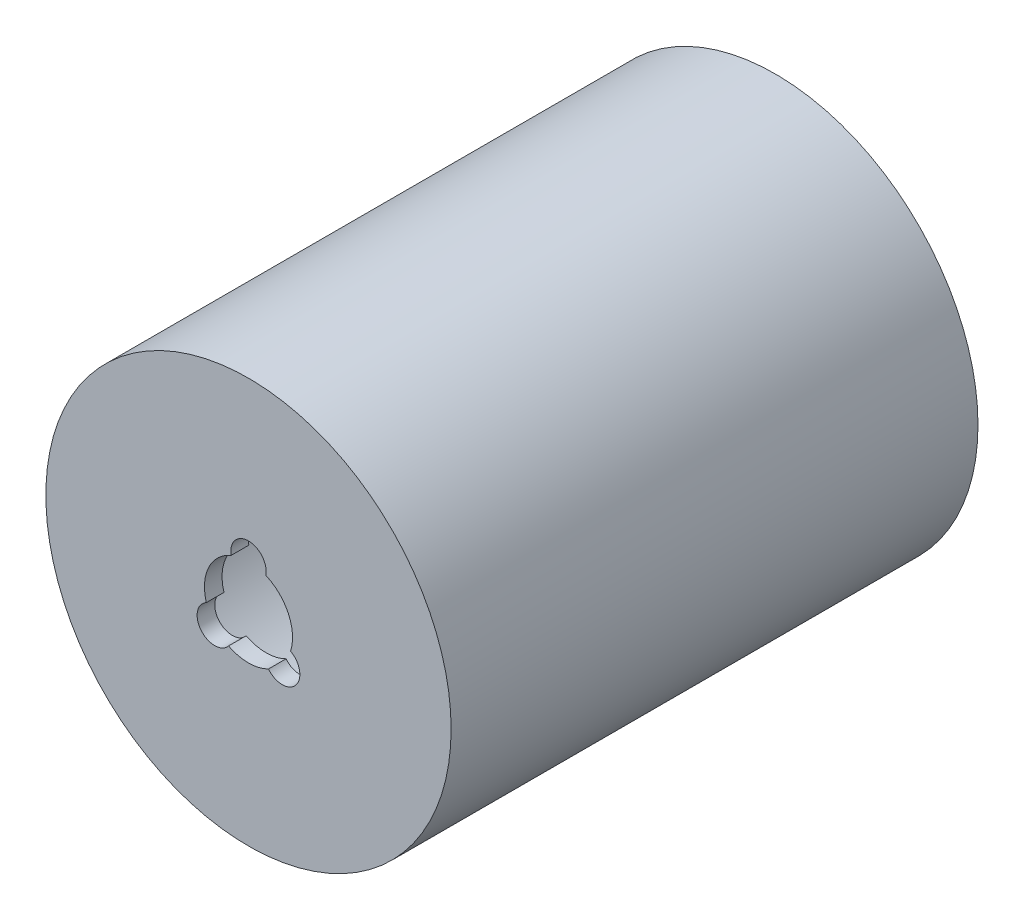
ISO-10303-21;
HEADER;
FILE_DESCRIPTION(('STEP AP214'),'2;1');
FILE_NAME('part.step','',(''),(''),'','','');
FILE_SCHEMA(('AUTOMOTIVE_DESIGN { 1 0 10303 214 1 1 1 1 }'));
ENDSEC;
DATA;
#1=APPLICATION_CONTEXT('core data for automotive mechanical design processes');
#2=APPLICATION_PROTOCOL_DEFINITION('international standard','automotive_design',2000,#1);
#3=PRODUCT_CONTEXT('',#1,'mechanical');
#4=PRODUCT('Part','Part','',(#3));
#5=PRODUCT_RELATED_PRODUCT_CATEGORY('part','',(#4));
#6=PRODUCT_DEFINITION_FORMATION('','',#4);
#7=PRODUCT_DEFINITION_CONTEXT('part definition',#1,'design');
#8=PRODUCT_DEFINITION('design','',#6,#7);
#9=PRODUCT_DEFINITION_SHAPE('','',#8);
#10=(LENGTH_UNIT() NAMED_UNIT(*) SI_UNIT(.MILLI.,.METRE.));
#11=(NAMED_UNIT(*) PLANE_ANGLE_UNIT() SI_UNIT($,.RADIAN.));
#12=(NAMED_UNIT(*) SI_UNIT($,.STERADIAN.) SOLID_ANGLE_UNIT());
#13=UNCERTAINTY_MEASURE_WITH_UNIT(LENGTH_MEASURE(1.E-05),#10,'distance_accuracy_value','');
#14=(GEOMETRIC_REPRESENTATION_CONTEXT(3) GLOBAL_UNCERTAINTY_ASSIGNED_CONTEXT((#13)) GLOBAL_UNIT_ASSIGNED_CONTEXT((#10,
#11,#12)) REPRESENTATION_CONTEXT('',''));
#15=CARTESIAN_POINT('',(0.,0.,0.));
#16=DIRECTION('',(0.,0.,1.));
#17=DIRECTION('',(1.,0.,0.));
#18=AXIS2_PLACEMENT_3D('',#15,#16,#17);
#19=CARTESIAN_POINT('',(0.,0.,1072.38147752167));
#20=DIRECTION('',(0.,0.,1.));
#21=DIRECTION('',(1.,0.,0.));
#22=AXIS2_PLACEMENT_3D('',#19,#20,#21);
#23=CYLINDRICAL_SURFACE('',#22,5.);
#24=CARTESIAN_POINT('',(0.,0.,57.8000000000001));
#25=DIRECTION('',(0.,0.,1.));
#26=DIRECTION('',(1.,0.,0.));
#27=AXIS2_PLACEMENT_3D('',#24,#25,#26);
#28=CIRCLE('',#27,5.);
#29=CARTESIAN_POINT('',(-2.26420311297507,-4.45795740930687,57.8));
#30=VERTEX_POINT('',#29);
#31=CARTESIAN_POINT('',(2.26420311297507,-4.45795740930687,57.8));
#32=VERTEX_POINT('',#31);
#33=EDGE_CURVE('E283',#30,#32,#28,.T.);
#34=ORIENTED_EDGE('',*,*,#33,.F.);
#35=DIRECTION('',(0.,0.,1.));
#36=VECTOR('',#35,1.);
#37=CARTESIAN_POINT('',(-2.26420311297507,-4.45795740930687,-0.001000000000001));
#38=LINE('',#37,#36);
#39=CARTESIAN_POINT('',(-2.26420311297507,-4.45795740930687,59.8));
#40=VERTEX_POINT('',#39);
#41=EDGE_CURVE('E107',#30,#40,#38,.T.);
#42=ORIENTED_EDGE('',*,*,#41,.T.);
#43=CARTESIAN_POINT('',(0.,0.,59.8000000000001));
#44=DIRECTION('',(0.,0.,1.));
#45=DIRECTION('',(1.,0.,0.));
#46=AXIS2_PLACEMENT_3D('',#43,#44,#45);
#47=CIRCLE('',#46,5.);
#48=CARTESIAN_POINT('',(2.26420311297507,-4.45795740930687,59.8));
#49=VERTEX_POINT('',#48);
#50=EDGE_CURVE('E289',#40,#49,#47,.T.);
#51=ORIENTED_EDGE('',*,*,#50,.T.);
#52=DIRECTION('',(0.,0.,1.));
#53=VECTOR('',#52,1.);
#54=CARTESIAN_POINT('',(2.26420311297507,-4.45795740930687,-0.001000000000001));
#55=LINE('',#54,#53);
#56=EDGE_CURVE('E578',#32,#49,#55,.T.);
#57=ORIENTED_EDGE('',*,*,#56,.F.);
#58=EDGE_LOOP('',(#34,#42,#51,#57));
#59=FACE_BOUND('',#58,.T.);
#60=ADVANCED_FACE('F83',(#59),#23,.F.);
#61=CARTESIAN_POINT('',(-1.95959179422654,4.6,59.8));
#62=VERTEX_POINT('',#61);
#63=CARTESIAN_POINT('',(-4.78340576371954,-1.45568859980928,59.8));
#64=VERTEX_POINT('',#63);
#65=EDGE_CURVE('E273',#62,#64,#47,.T.);
#66=ORIENTED_EDGE('',*,*,#65,.T.);
#67=DIRECTION('',(0.,0.,1.));
#68=VECTOR('',#67,1.);
#69=CARTESIAN_POINT('',(-4.78340576371954,-1.45568859980928,-0.001000000000001));
#70=LINE('',#69,#68);
#71=CARTESIAN_POINT('',(-4.78340576371954,-1.45568859980928,57.8));
#72=VERTEX_POINT('',#71);
#73=EDGE_CURVE('E257',#72,#64,#70,.T.);
#74=ORIENTED_EDGE('',*,*,#73,.F.);
#75=CARTESIAN_POINT('',(-1.95959179422654,4.6,57.8));
#76=VERTEX_POINT('',#75);
#77=EDGE_CURVE('E271',#76,#72,#28,.T.);
#78=ORIENTED_EDGE('',*,*,#77,.F.);
#79=DIRECTION('',(0.,0.,1.));
#80=VECTOR('',#79,1.);
#81=CARTESIAN_POINT('',(-1.95959179422654,4.6,-0.001000000000001));
#82=LINE('',#81,#80);
#83=EDGE_CURVE('E588',#76,#62,#82,.T.);
#84=ORIENTED_EDGE('',*,*,#83,.T.);
#85=EDGE_LOOP('',(#66,#74,#78,#84));
#86=FACE_BOUND('',#85,.T.);
#87=ADVANCED_FACE('F269',(#86),#23,.F.);
#88=CARTESIAN_POINT('',(0.,0.,1072.38147752167));
#89=DIRECTION('',(0.,0.,1.));
#90=DIRECTION('',(1.,0.,0.));
#91=AXIS2_PLACEMENT_3D('',#88,#89,#90);
#92=CYLINDRICAL_SURFACE('',#91,17.);
#93=CARTESIAN_POINT('',(0.,0.,1.80000000000002));
#94=DIRECTION('',(0.,0.,1.));
#95=DIRECTION('',(1.,0.,0.));
#96=AXIS2_PLACEMENT_3D('',#93,#94,#95);
#97=CIRCLE('',#96,17.);
#98=CARTESIAN_POINT('',(17.,0.,1.80000000000002));
#99=VERTEX_POINT('',#98);
#100=EDGE_CURVE('E297',#99,#99,#97,.T.);
#101=ORIENTED_EDGE('',*,*,#100,.F.);
#102=EDGE_LOOP('',(#101));
#103=FACE_BOUND('',#102,.T.);
#104=CARTESIAN_POINT('',(0.,0.,29.8));
#105=DIRECTION('',(0.,0.,1.));
#106=DIRECTION('',(1.,0.,0.));
#107=AXIS2_PLACEMENT_3D('',#104,#105,#106);
#108=CIRCLE('',#107,17.);
#109=CARTESIAN_POINT('',(-4.68397596917369,16.3419817990415,29.8));
#110=VERTEX_POINT('',#109);
#111=CARTESIAN_POINT('',(4.68397596917369,16.3419817990415,29.8));
#112=VERTEX_POINT('',#111);
#113=EDGE_CURVE('E410',#110,#112,#108,.F.);
#114=ORIENTED_EDGE('',*,*,#113,.F.);
#115=DIRECTION('',(0.,0.,1.));
#116=VECTOR('',#115,1.);
#117=CARTESIAN_POINT('',(-4.68397596917369,16.3419817990415,28.8));
#118=LINE('',#117,#116);
#119=CARTESIAN_POINT('',(-4.68397596917369,16.3419817990415,28.8));
#120=VERTEX_POINT('',#119);
#121=EDGE_CURVE('E334',#120,#110,#118,.T.);
#122=ORIENTED_EDGE('',*,*,#121,.F.);
#123=CARTESIAN_POINT('',(0.,0.,28.8));
#124=DIRECTION('',(0.,0.,1.));
#125=DIRECTION('',(1.,0.,0.));
#126=AXIS2_PLACEMENT_3D('',#123,#124,#125);
#127=CIRCLE('',#126,17.);
#128=CARTESIAN_POINT('',(4.68397596917369,16.3419817990415,28.8));
#129=VERTEX_POINT('',#128);
#130=EDGE_CURVE('E432',#120,#129,#127,.T.);
#131=ORIENTED_EDGE('',*,*,#130,.T.);
#132=DIRECTION('',(0.,0.,1.));
#133=VECTOR('',#132,1.);
#134=CARTESIAN_POINT('',(4.68397596917369,16.3419817990415,28.8));
#135=LINE('',#134,#133);
#136=EDGE_CURVE('E329',#129,#112,#135,.T.);
#137=ORIENTED_EDGE('',*,*,#136,.T.);
#138=EDGE_LOOP('',(#114,#122,#131,#137));
#139=FACE_BOUND('',#138,.T.);
#140=ADVANCED_FACE('F630',(#103,#139),#92,.F.);
#141=CARTESIAN_POINT('',(0.,0.,28.8));
#142=DIRECTION('',(0.939692620785902,-0.342020143325687,0.));
#143=DIRECTION('',(0.342020143325687,0.939692620785902,0.));
#144=AXIS2_PLACEMENT_3D('',#141,#142,#143);
#145=PLANE('',#144);
#146=DIRECTION('',(0.342020143325687,0.939692620785902,0.));
#147=VECTOR('',#146,1.);
#148=CARTESIAN_POINT('',(0.,0.,29.8));
#149=LINE('',#148,#147);
#150=CARTESIAN_POINT('',(6.56678675185322,18.0420983190894,29.8));
#151=VERTEX_POINT('',#150);
#152=CARTESIAN_POINT('',(7.59284718183028,20.8611761814471,29.8));
#153=VERTEX_POINT('',#152);
#154=EDGE_CURVE('E564',#151,#153,#149,.T.);
#155=ORIENTED_EDGE('',*,*,#154,.T.);
#156=DIRECTION('',(0.,0.,1.));
#157=VECTOR('',#156,1.);
#158=CARTESIAN_POINT('',(7.59284718183028,20.8611761814471,28.8));
#159=LINE('',#158,#157);
#160=CARTESIAN_POINT('',(7.59284718183028,20.8611761814471,28.8));
#161=VERTEX_POINT('',#160);
#162=EDGE_CURVE('E344',#161,#153,#159,.T.);
#163=ORIENTED_EDGE('',*,*,#162,.F.);
#164=DIRECTION('',(0.342020143325687,0.939692620785902,0.));
#165=VECTOR('',#164,1.);
#166=CARTESIAN_POINT('',(0.,0.,28.8));
#167=LINE('',#166,#165);
#168=CARTESIAN_POINT('',(6.56678675185322,18.0420983190894,28.8));
#169=VERTEX_POINT('',#168);
#170=EDGE_CURVE('E425',#169,#161,#167,.T.);
#171=ORIENTED_EDGE('',*,*,#170,.F.);
#172=DIRECTION('',(0.,0.,1.));
#173=VECTOR('',#172,1.);
#174=CARTESIAN_POINT('',(6.56678675185322,18.0420983190894,28.8));
#175=LINE('',#174,#173);
#176=EDGE_CURVE('E312',#169,#151,#175,.T.);
#177=ORIENTED_EDGE('',*,*,#176,.T.);
#178=EDGE_LOOP('',(#155,#163,#171,#177));
#179=FACE_BOUND('',#178,.T.);
#180=ADVANCED_FACE('F692',(#179),#145,.F.);
#181=CARTESIAN_POINT('',(0.,0.,28.8));
#182=DIRECTION('',(0.,0.,1.));
#183=DIRECTION('',(1.,0.,0.));
#184=AXIS2_PLACEMENT_3D('',#181,#182,#183);
#185=CYLINDRICAL_SURFACE('',#184,19.2);
#186=DIRECTION('',(0.,0.,1.));
#187=VECTOR('',#186,1.);
#188=CARTESIAN_POINT('',(-6.56678675185351,18.0420983190894,28.8));
#189=LINE('',#188,#187);
#190=CARTESIAN_POINT('',(-6.56678675185351,18.0420983190894,28.8));
#191=VERTEX_POINT('',#190);
#192=CARTESIAN_POINT('',(-6.56678675185351,18.0420983190894,29.8));
#193=VERTEX_POINT('',#192);
#194=EDGE_CURVE('E354',#191,#193,#189,.T.);
#195=ORIENTED_EDGE('',*,*,#194,.T.);
#196=CARTESIAN_POINT('',(0.,0.,29.8));
#197=DIRECTION('',(0.,0.,1.));
#198=DIRECTION('',(1.,0.,0.));
#199=AXIS2_PLACEMENT_3D('',#196,#197,#198);
#200=CIRCLE('',#199,19.2);
#201=EDGE_CURVE('E520',#151,#193,#200,.F.);
#202=ORIENTED_EDGE('',*,*,#201,.F.);
#203=ORIENTED_EDGE('',*,*,#176,.F.);
#204=CARTESIAN_POINT('',(0.,0.,28.8));
#205=DIRECTION('',(0.,0.,1.));
#206=DIRECTION('',(1.,0.,0.));
#207=AXIS2_PLACEMENT_3D('',#204,#205,#206);
#208=CIRCLE('',#207,19.2);
#209=EDGE_CURVE('E411',#169,#191,#208,.F.);
#210=ORIENTED_EDGE('',*,*,#209,.T.);
#211=EDGE_LOOP('',(#195,#202,#203,#210));
#212=FACE_BOUND('',#211,.T.);
#213=ADVANCED_FACE('F682',(#212),#185,.F.);
#214=CARTESIAN_POINT('',(0.,0.,28.8));
#215=DIRECTION('',(0.939692620785897,0.342020143325699,0.));
#216=DIRECTION('',(-0.342020143325699,0.939692620785897,0.));
#217=AXIS2_PLACEMENT_3D('',#214,#215,#216);
#218=PLANE('',#217);
#219=DIRECTION('',(0.,0.,1.));
#220=VECTOR('',#219,1.);
#221=CARTESIAN_POINT('',(-7.5928471818306,20.8611761814471,28.8));
#222=LINE('',#221,#220);
#223=CARTESIAN_POINT('',(-7.5928471818306,20.8611761814471,28.8));
#224=VERTEX_POINT('',#223);
#225=CARTESIAN_POINT('',(-7.5928471818306,20.8611761814471,29.8));
#226=VERTEX_POINT('',#225);
#227=EDGE_CURVE('E349',#224,#226,#222,.T.);
#228=ORIENTED_EDGE('',*,*,#227,.T.);
#229=DIRECTION('',(-0.342020143325699,0.939692620785897,0.));
#230=VECTOR('',#229,1.);
#231=CARTESIAN_POINT('',(0.,0.,29.8));
#232=LINE('',#231,#230);
#233=EDGE_CURVE('E551',#193,#226,#232,.T.);
#234=ORIENTED_EDGE('',*,*,#233,.F.);
#235=ORIENTED_EDGE('',*,*,#194,.F.);
#236=DIRECTION('',(-0.342020143325699,0.939692620785897,0.));
#237=VECTOR('',#236,1.);
#238=CARTESIAN_POINT('',(0.,0.,28.8));
#239=LINE('',#238,#237);
#240=EDGE_CURVE('E418',#191,#224,#239,.T.);
#241=ORIENTED_EDGE('',*,*,#240,.T.);
#242=EDGE_LOOP('',(#228,#234,#235,#241));
#243=FACE_BOUND('',#242,.T.);
#244=ADVANCED_FACE('F686',(#243),#218,.T.);
#245=CARTESIAN_POINT('',(-1.,19.9722249756745,28.8));
#246=CARTESIAN_POINT('',(-1.83751743884076,19.9722249756745,28.8));
#247=CARTESIAN_POINT('',(-3.40068888477795,17.6065514435698,28.8));
#248=CARTESIAN_POINT('',(-4.50526886810057,16.5180823598799,28.8));
#249=B_SPLINE_CURVE_WITH_KNOTS('',3,(#245,#246,#247,#248),.UNSPECIFIED.,.F.,.F.,(4,4),(0.,1.),.UNSPECIFIED.);
#250=DIRECTION('',(0.,0.,1.));
#251=VECTOR('',#250,1.);
#252=SURFACE_OF_LINEAR_EXTRUSION('',#249,#251);
#253=DIRECTION('',(0.,0.,1.));
#254=VECTOR('',#253,1.);
#255=CARTESIAN_POINT('',(-4.50526886810057,16.5180823598799,28.8));
#256=LINE('',#255,#254);
#257=CARTESIAN_POINT('',(-4.50526886810057,16.5180823598799,28.8));
#258=VERTEX_POINT('',#257);
#259=CARTESIAN_POINT('',(-4.50526886810057,16.5180823598799,29.8));
#260=VERTEX_POINT('',#259);
#261=EDGE_CURVE('E339',#258,#260,#256,.T.);
#262=ORIENTED_EDGE('',*,*,#261,.T.);
#263=CARTESIAN_POINT('',(-1.,19.9722249756745,29.8));
#264=CARTESIAN_POINT('',(-1.83751743884076,19.9722249756745,29.8));
#265=CARTESIAN_POINT('',(-3.40068888477795,17.6065514435698,29.8));
#266=CARTESIAN_POINT('',(-4.50526886810057,16.5180823598799,29.8));
#267=B_SPLINE_CURVE_WITH_KNOTS('',3,(#263,#264,#265,#266),.UNSPECIFIED.,.F.,.F.,(4,4),(0.,1.),.UNSPECIFIED.);
#268=CARTESIAN_POINT('',(-1.,19.9722249756745,29.8));
#269=VERTEX_POINT('',#268);
#270=EDGE_CURVE('E523',#269,#260,#267,.T.);
#271=ORIENTED_EDGE('',*,*,#270,.F.);
#272=DIRECTION('',(0.,0.,1.));
#273=VECTOR('',#272,1.);
#274=CARTESIAN_POINT('',(-1.,19.9722249756745,28.8));
#275=LINE('',#274,#273);
#276=CARTESIAN_POINT('',(-1.,19.9722249756745,28.8));
#277=VERTEX_POINT('',#276);
#278=EDGE_CURVE('E313',#277,#269,#275,.T.);
#279=ORIENTED_EDGE('',*,*,#278,.F.);
#280=EDGE_CURVE('E366',#277,#258,#249,.T.);
#281=ORIENTED_EDGE('',*,*,#280,.T.);
#282=EDGE_LOOP('',(#262,#271,#279,#281));
#283=FACE_BOUND('',#282,.T.);
#284=ADVANCED_FACE('F473',(#283),#252,.T.);
#285=CARTESIAN_POINT('',(-10.4776887180417,10.6327735007392,28.8));
#286=DIRECTION('',(-0.701893189425482,0.712282212776737,0.));
#287=DIRECTION('',(-0.712282212776737,-0.701893189425482,0.));
#288=AXIS2_PLACEMENT_3D('',#285,#286,#287);
#289=PLANE('',#288);
#290=ORIENTED_EDGE('',*,*,#121,.T.);
#291=DIRECTION('',(-0.712282212776737,-0.701893189425482,0.));
#292=VECTOR('',#291,1.);
#293=CARTESIAN_POINT('',(-10.4776887180417,10.6327735007392,29.8));
#294=LINE('',#293,#292);
#295=EDGE_CURVE('E491',#260,#110,#294,.T.);
#296=ORIENTED_EDGE('',*,*,#295,.F.);
#297=ORIENTED_EDGE('',*,*,#261,.F.);
#298=DIRECTION('',(-0.712282212776737,-0.701893189425482,0.));
#299=VECTOR('',#298,1.);
#300=CARTESIAN_POINT('',(-10.4776887180417,10.6327735007392,28.8));
#301=LINE('',#300,#299);
#302=EDGE_CURVE('E429',#258,#120,#301,.T.);
#303=ORIENTED_EDGE('',*,*,#302,.T.);
#304=EDGE_LOOP('',(#290,#296,#297,#303));
#305=FACE_BOUND('',#304,.T.);
#306=ADVANCED_FACE('F695',(#305),#289,.T.);
#307=CARTESIAN_POINT('',(10.4776887180417,10.6327735007392,28.8));
#308=DIRECTION('',(-0.701893189425482,-0.712282212776737,0.));
#309=DIRECTION('',(0.712282212776737,-0.701893189425482,0.));
#310=AXIS2_PLACEMENT_3D('',#307,#308,#309);
#311=PLANE('',#310);
#312=DIRECTION('',(0.712282212776737,-0.701893189425482,0.));
#313=VECTOR('',#312,1.);
#314=CARTESIAN_POINT('',(10.4776887180417,10.6327735007392,29.8));
#315=LINE('',#314,#313);
#316=CARTESIAN_POINT('',(4.50526886810057,16.5180823598799,29.8));
#317=VERTEX_POINT('',#316);
#318=EDGE_CURVE('E496',#317,#112,#315,.T.);
#319=ORIENTED_EDGE('',*,*,#318,.T.);
#320=ORIENTED_EDGE('',*,*,#136,.F.);
#321=DIRECTION('',(0.712282212776737,-0.701893189425482,0.));
#322=VECTOR('',#321,1.);
#323=CARTESIAN_POINT('',(10.4776887180417,10.6327735007392,28.8));
#324=LINE('',#323,#322);
#325=CARTESIAN_POINT('',(4.50526886810057,16.5180823598799,28.8));
#326=VERTEX_POINT('',#325);
#327=EDGE_CURVE('E436',#326,#129,#324,.T.);
#328=ORIENTED_EDGE('',*,*,#327,.F.);
#329=DIRECTION('',(0.,0.,1.));
#330=VECTOR('',#329,1.);
#331=CARTESIAN_POINT('',(4.50526886810057,16.5180823598799,28.8));
#332=LINE('',#331,#330);
#333=EDGE_CURVE('E324',#326,#317,#332,.T.);
#334=ORIENTED_EDGE('',*,*,#333,.T.);
#335=EDGE_LOOP('',(#319,#320,#328,#334));
#336=FACE_BOUND('',#335,.T.);
#337=ADVANCED_FACE('F700',(#336),#311,.F.);
#338=CARTESIAN_POINT('',(1.,19.9722249756745,28.8));
#339=CARTESIAN_POINT('',(1.83751743884076,19.9722249756745,28.8));
#340=CARTESIAN_POINT('',(3.40068888477795,17.6065514435698,28.8));
#341=CARTESIAN_POINT('',(4.50526886810057,16.5180823598799,28.8));
#342=B_SPLINE_CURVE_WITH_KNOTS('',3,(#338,#339,#340,#341),.UNSPECIFIED.,.F.,.F.,(4,4),(0.,1.),.UNSPECIFIED.);
#343=DIRECTION('',(0.,0.,1.));
#344=VECTOR('',#343,1.);
#345=SURFACE_OF_LINEAR_EXTRUSION('',#342,#344);
#346=CARTESIAN_POINT('',(1.,19.9722249756745,29.8));
#347=CARTESIAN_POINT('',(1.83751743884076,19.9722249756745,29.8));
#348=CARTESIAN_POINT('',(3.40068888477795,17.6065514435698,29.8));
#349=CARTESIAN_POINT('',(4.50526886810057,16.5180823598799,29.8));
#350=B_SPLINE_CURVE_WITH_KNOTS('',3,(#346,#347,#348,#349),.UNSPECIFIED.,.F.,.F.,(4,4),(0.,1.),.UNSPECIFIED.);
#351=CARTESIAN_POINT('',(1.,19.9722249756745,29.8));
#352=VERTEX_POINT('',#351);
#353=EDGE_CURVE('E535',#352,#317,#350,.T.);
#354=ORIENTED_EDGE('',*,*,#353,.T.);
#355=ORIENTED_EDGE('',*,*,#333,.F.);
#356=CARTESIAN_POINT('',(1.,19.9722249756745,28.8));
#357=VERTEX_POINT('',#356);
#358=EDGE_CURVE('E440',#357,#326,#342,.T.);
#359=ORIENTED_EDGE('',*,*,#358,.F.);
#360=DIRECTION('',(0.,0.,1.));
#361=VECTOR('',#360,1.);
#362=CARTESIAN_POINT('',(1.,19.9722249756745,28.8));
#363=LINE('',#362,#361);
#364=EDGE_CURVE('E319',#357,#352,#363,.T.);
#365=ORIENTED_EDGE('',*,*,#364,.T.);
#366=EDGE_LOOP('',(#354,#355,#359,#365));
#367=FACE_BOUND('',#366,.T.);
#368=ADVANCED_FACE('F460',(#367),#345,.F.);
#369=CARTESIAN_POINT('',(0.,19.9722249756745,28.8));
#370=DIRECTION('',(0.,-1.,0.));
#371=DIRECTION('',(0.,0.,-1.));
#372=AXIS2_PLACEMENT_3D('',#369,#370,#371);
#373=PLANE('',#372);
#374=DIRECTION('',(1.,0.,0.));
#375=VECTOR('',#374,1.);
#376=CARTESIAN_POINT('',(0.,19.9722249756745,29.8));
#377=LINE('',#376,#375);
#378=EDGE_CURVE('E528',#269,#352,#377,.T.);
#379=ORIENTED_EDGE('',*,*,#378,.T.);
#380=ORIENTED_EDGE('',*,*,#364,.F.);
#381=DIRECTION('',(1.,0.,0.));
#382=VECTOR('',#381,1.);
#383=CARTESIAN_POINT('',(0.,19.9722249756745,28.8));
#384=LINE('',#383,#382);
#385=EDGE_CURVE('E447',#277,#357,#384,.T.);
#386=ORIENTED_EDGE('',*,*,#385,.F.);
#387=ORIENTED_EDGE('',*,*,#278,.T.);
#388=EDGE_LOOP('',(#379,#380,#386,#387));
#389=FACE_BOUND('',#388,.T.);
#390=ADVANCED_FACE('F466',(#389),#373,.F.);
#391=CARTESIAN_POINT('',(0.,0.,57.8000000000001));
#392=DIRECTION('',(0.,0.,1.));
#393=DIRECTION('',(1.,0.,0.));
#394=AXIS2_PLACEMENT_3D('',#391,#392,#393);
#395=CIRCLE('',#394,17.);
#396=CARTESIAN_POINT('',(17.,0.,57.8000000000001));
#397=VERTEX_POINT('',#396);
#398=EDGE_CURVE('E293',#397,#397,#395,.T.);
#399=ORIENTED_EDGE('',*,*,#398,.T.);
#400=EDGE_LOOP('',(#399));
#401=FACE_BOUND('',#400,.T.);
#402=CARTESIAN_POINT('',(-4.68397596917369,16.3419817990415,31.8));
#403=VERTEX_POINT('',#402);
#404=CARTESIAN_POINT('',(-4.68397596917369,16.3419817990415,32.7999999999999));
#405=VERTEX_POINT('',#404);
#406=EDGE_CURVE('E333',#403,#405,#118,.T.);
#407=ORIENTED_EDGE('',*,*,#406,.F.);
#408=CARTESIAN_POINT('',(0.,0.,31.8000000000001));
#409=DIRECTION('',(0.,0.,1.));
#410=DIRECTION('',(1.,0.,0.));
#411=AXIS2_PLACEMENT_3D('',#408,#409,#410);
#412=CIRCLE('',#411,17.);
#413=CARTESIAN_POINT('',(4.68397596917369,16.3419817990415,31.8));
#414=VERTEX_POINT('',#413);
#415=EDGE_CURVE('E487',#403,#414,#412,.F.);
#416=ORIENTED_EDGE('',*,*,#415,.T.);
#417=CARTESIAN_POINT('',(4.68397596917369,16.3419817990415,32.8));
#418=VERTEX_POINT('',#417);
#419=EDGE_CURVE('E328',#414,#418,#135,.T.);
#420=ORIENTED_EDGE('',*,*,#419,.T.);
#421=CARTESIAN_POINT('',(0.,0.,32.8));
#422=DIRECTION('',(0.,0.,1.));
#423=DIRECTION('',(1.,0.,0.));
#424=AXIS2_PLACEMENT_3D('',#421,#422,#423);
#425=CIRCLE('',#424,17.);
#426=EDGE_CURVE('E383',#405,#418,#425,.T.);
#427=ORIENTED_EDGE('',*,*,#426,.F.);
#428=EDGE_LOOP('',(#407,#416,#420,#427));
#429=FACE_BOUND('',#428,.T.);
#430=ADVANCED_FACE('F623',(#401,#429),#92,.F.);
#431=CARTESIAN_POINT('',(0.,0.,0.));
#432=DIRECTION('',(0.,0.,1.));
#433=DIRECTION('',(1.,0.,0.));
#434=AXIS2_PLACEMENT_3D('',#431,#432,#433);
#435=PLANE('',#434);
#436=CARTESIAN_POINT('',(0.,0.,0.));
#437=DIRECTION('',(0.,0.,1.));
#438=DIRECTION('',(1.,0.,0.));
#439=AXIS2_PLACEMENT_3D('',#436,#437,#438);
#440=CIRCLE('',#439,23.);
#441=CARTESIAN_POINT('',(23.,0.,0.));
#442=VERTEX_POINT('',#441);
#443=EDGE_CURVE('E12',#442,#442,#440,.T.);
#444=ORIENTED_EDGE('',*,*,#443,.F.);
#445=EDGE_LOOP('',(#444));
#446=FACE_BOUND('',#445,.T.);
#447=CARTESIAN_POINT('',(0.,0.,0.));
#448=DIRECTION('',(0.,0.,1.));
#449=DIRECTION('',(1.,0.,0.));
#450=AXIS2_PLACEMENT_3D('',#447,#448,#449);
#451=CIRCLE('',#450,13.);
#452=CARTESIAN_POINT('',(13.,0.,0.));
#453=VERTEX_POINT('',#452);
#454=EDGE_CURVE('E308',#453,#453,#451,.T.);
#455=ORIENTED_EDGE('',*,*,#454,.T.);
#456=EDGE_LOOP('',(#455));
#457=FACE_BOUND('',#456,.T.);
#458=ADVANCED_FACE('F85',(#446,#457),#435,.F.);
#459=CARTESIAN_POINT('',(0.,0.,1072.38147752167));
#460=DIRECTION('',(0.,0.,1.));
#461=DIRECTION('',(1.,0.,0.));
#462=AXIS2_PLACEMENT_3D('',#459,#460,#461);
#463=CYLINDRICAL_SURFACE('',#462,23.);
#464=ORIENTED_EDGE('',*,*,#443,.T.);
#465=EDGE_LOOP('',(#464));
#466=FACE_BOUND('',#465,.T.);
#467=CARTESIAN_POINT('',(0.,0.,59.8000000000001));
#468=DIRECTION('',(0.,0.,1.));
#469=DIRECTION('',(1.,0.,0.));
#470=AXIS2_PLACEMENT_3D('',#467,#468,#469);
#471=CIRCLE('',#470,23.);
#472=CARTESIAN_POINT('',(23.,0.,59.8000000000001));
#473=VERTEX_POINT('',#472);
#474=EDGE_CURVE('E92',#473,#473,#471,.T.);
#475=ORIENTED_EDGE('',*,*,#474,.F.);
#476=EDGE_LOOP('',(#475));
#477=FACE_BOUND('',#476,.T.);
#478=ADVANCED_FACE('F614',(#466,#477),#463,.T.);
#479=CARTESIAN_POINT('',(0.,0.,59.8));
#480=DIRECTION('',(0.,0.,1.));
#481=DIRECTION('',(1.,0.,0.));
#482=AXIS2_PLACEMENT_3D('',#479,#480,#481);
#483=PLANE('',#482);
#484=CARTESIAN_POINT('',(-3.8302222155949,-3.21393804843269,59.8));
#485=DIRECTION('',(0.,0.,1.));
#486=DIRECTION('',(1.,0.,0.));
#487=AXIS2_PLACEMENT_3D('',#484,#485,#486);
#488=CIRCLE('',#487,2.);
#489=EDGE_CURVE('E275',#64,#40,#488,.T.);
#490=ORIENTED_EDGE('',*,*,#489,.F.);
#491=ORIENTED_EDGE('',*,*,#65,.F.);
#492=CARTESIAN_POINT('',(0.,5.,59.8));
#493=DIRECTION('',(0.,0.,1.));
#494=DIRECTION('',(1.,0.,0.));
#495=AXIS2_PLACEMENT_3D('',#492,#493,#494);
#496=CIRCLE('',#495,2.);
#497=CARTESIAN_POINT('',(1.95959179422654,4.6,59.8));
#498=VERTEX_POINT('',#497);
#499=EDGE_CURVE('E577',#498,#62,#496,.T.);
#500=ORIENTED_EDGE('',*,*,#499,.F.);
#501=CARTESIAN_POINT('',(4.78340576371954,-1.45568859980928,59.8));
#502=VERTEX_POINT('',#501);
#503=EDGE_CURVE('E282',#502,#498,#47,.T.);
#504=ORIENTED_EDGE('',*,*,#503,.F.);
#505=CARTESIAN_POINT('',(3.8302222155949,-3.21393804843269,59.8));
#506=DIRECTION('',(0.,0.,1.));
#507=DIRECTION('',(1.,0.,0.));
#508=AXIS2_PLACEMENT_3D('',#505,#506,#507);
#509=CIRCLE('',#508,2.);
#510=EDGE_CURVE('E581',#49,#502,#509,.T.);
#511=ORIENTED_EDGE('',*,*,#510,.F.);
#512=ORIENTED_EDGE('',*,*,#50,.F.);
#513=EDGE_LOOP('',(#490,#491,#500,#504,#511,#512));
#514=FACE_BOUND('',#513,.T.);
#515=ORIENTED_EDGE('',*,*,#474,.T.);
#516=EDGE_LOOP('',(#515));
#517=FACE_BOUND('',#516,.T.);
#518=ADVANCED_FACE('F605',(#514,#517),#483,.T.);
#519=ORIENTED_EDGE('',*,*,#503,.T.);
#520=DIRECTION('',(0.,0.,1.));
#521=VECTOR('',#520,1.);
#522=CARTESIAN_POINT('',(1.95959179422654,4.6,-0.001000000000001));
#523=LINE('',#522,#521);
#524=CARTESIAN_POINT('',(1.95959179422654,4.6,57.8));
#525=VERTEX_POINT('',#524);
#526=EDGE_CURVE('E589',#525,#498,#523,.T.);
#527=ORIENTED_EDGE('',*,*,#526,.F.);
#528=CARTESIAN_POINT('',(4.78340576371954,-1.45568859980928,57.8));
#529=VERTEX_POINT('',#528);
#530=EDGE_CURVE('E285',#529,#525,#28,.T.);
#531=ORIENTED_EDGE('',*,*,#530,.F.);
#532=DIRECTION('',(0.,0.,1.));
#533=VECTOR('',#532,1.);
#534=CARTESIAN_POINT('',(4.78340576371954,-1.45568859980928,-0.001000000000001));
#535=LINE('',#534,#533);
#536=EDGE_CURVE('E99',#529,#502,#535,.T.);
#537=ORIENTED_EDGE('',*,*,#536,.T.);
#538=EDGE_LOOP('',(#519,#527,#531,#537));
#539=FACE_BOUND('',#538,.T.);
#540=ADVANCED_FACE('F621',(#539),#23,.F.);
#541=CARTESIAN_POINT('',(0.,0.,57.8));
#542=DIRECTION('',(0.,0.,1.));
#543=DIRECTION('',(1.,0.,0.));
#544=AXIS2_PLACEMENT_3D('',#541,#542,#543);
#545=PLANE('',#544);
#546=ORIENTED_EDGE('',*,*,#398,.F.);
#547=EDGE_LOOP('',(#546));
#548=FACE_BOUND('',#547,.T.);
#549=ORIENTED_EDGE('',*,*,#77,.T.);
#550=CARTESIAN_POINT('',(-3.8302222155949,-3.21393804843269,57.8));
#551=DIRECTION('',(0.,0.,1.));
#552=DIRECTION('',(1.,0.,0.));
#553=AXIS2_PLACEMENT_3D('',#550,#551,#552);
#554=CIRCLE('',#553,2.);
#555=EDGE_CURVE('E254',#30,#72,#554,.F.);
#556=ORIENTED_EDGE('',*,*,#555,.F.);
#557=ORIENTED_EDGE('',*,*,#33,.T.);
#558=CARTESIAN_POINT('',(3.8302222155949,-3.21393804843269,57.8));
#559=DIRECTION('',(0.,0.,1.));
#560=DIRECTION('',(1.,0.,0.));
#561=AXIS2_PLACEMENT_3D('',#558,#559,#560);
#562=CIRCLE('',#561,2.);
#563=EDGE_CURVE('E574',#529,#32,#562,.F.);
#564=ORIENTED_EDGE('',*,*,#563,.F.);
#565=ORIENTED_EDGE('',*,*,#530,.T.);
#566=CARTESIAN_POINT('',(0.,5.,57.8));
#567=DIRECTION('',(0.,0.,1.));
#568=DIRECTION('',(1.,0.,0.));
#569=AXIS2_PLACEMENT_3D('',#566,#567,#568);
#570=CIRCLE('',#569,2.);
#571=EDGE_CURVE('E280',#76,#525,#570,.F.);
#572=ORIENTED_EDGE('',*,*,#571,.F.);
#573=EDGE_LOOP('',(#549,#556,#557,#564,#565,#572));
#574=FACE_BOUND('',#573,.T.);
#575=ADVANCED_FACE('F278',(#548,#574),#545,.F.);
#576=CARTESIAN_POINT('',(0.,0.,1.8));
#577=DIRECTION('',(0.,0.,1.));
#578=DIRECTION('',(1.,0.,0.));
#579=AXIS2_PLACEMENT_3D('',#576,#577,#578);
#580=PLANE('',#579);
#581=ORIENTED_EDGE('',*,*,#100,.T.);
#582=EDGE_LOOP('',(#581));
#583=FACE_BOUND('',#582,.T.);
#584=CARTESIAN_POINT('',(0.,0.,1.80000000000002));
#585=DIRECTION('',(0.,0.,1.));
#586=DIRECTION('',(1.,0.,0.));
#587=AXIS2_PLACEMENT_3D('',#584,#585,#586);
#588=CIRCLE('',#587,13.);
#589=CARTESIAN_POINT('',(13.,0.,1.80000000000002));
#590=VERTEX_POINT('',#589);
#591=EDGE_CURVE('E302',#590,#590,#588,.T.);
#592=ORIENTED_EDGE('',*,*,#591,.F.);
#593=EDGE_LOOP('',(#592));
#594=FACE_BOUND('',#593,.T.);
#595=ADVANCED_FACE('F637',(#583,#594),#580,.T.);
#596=CARTESIAN_POINT('',(0.,0.,1072.38147752167));
#597=DIRECTION('',(0.,0.,1.));
#598=DIRECTION('',(1.,0.,0.));
#599=AXIS2_PLACEMENT_3D('',#596,#597,#598);
#600=CYLINDRICAL_SURFACE('',#599,13.);
#601=ORIENTED_EDGE('',*,*,#454,.F.);
#602=EDGE_LOOP('',(#601));
#603=FACE_BOUND('',#602,.T.);
#604=ORIENTED_EDGE('',*,*,#591,.T.);
#605=EDGE_LOOP('',(#604));
#606=FACE_BOUND('',#605,.T.);
#607=ADVANCED_FACE('F474',(#603,#606),#600,.F.);
#608=CARTESIAN_POINT('',(7.59284718183028,20.8611761814471,31.8));
#609=VERTEX_POINT('',#608);
#610=CARTESIAN_POINT('',(7.59284718183028,20.8611761814471,32.8));
#611=VERTEX_POINT('',#610);
#612=EDGE_CURVE('E343',#609,#611,#159,.T.);
#613=ORIENTED_EDGE('',*,*,#612,.F.);
#614=DIRECTION('',(0.342020143325687,0.939692620785902,0.));
#615=VECTOR('',#614,1.);
#616=CARTESIAN_POINT('',(0.,0.,31.8));
#617=LINE('',#616,#615);
#618=CARTESIAN_POINT('',(6.56678675185322,18.0420983190894,31.8));
#619=VERTEX_POINT('',#618);
#620=EDGE_CURVE('E552',#619,#609,#617,.T.);
#621=ORIENTED_EDGE('',*,*,#620,.F.);
#622=CARTESIAN_POINT('',(6.56678675185322,18.0420983190894,32.8));
#623=VERTEX_POINT('',#622);
#624=EDGE_CURVE('E358',#619,#623,#175,.T.);
#625=ORIENTED_EDGE('',*,*,#624,.T.);
#626=DIRECTION('',(0.342020143325687,0.939692620785902,0.));
#627=VECTOR('',#626,1.);
#628=CARTESIAN_POINT('',(0.,0.,32.8));
#629=LINE('',#628,#627);
#630=EDGE_CURVE('E375',#623,#611,#629,.T.);
#631=ORIENTED_EDGE('',*,*,#630,.T.);
#632=EDGE_LOOP('',(#613,#621,#625,#631));
#633=FACE_BOUND('',#632,.T.);
#634=ADVANCED_FACE('F680',(#633),#145,.F.);
#635=CARTESIAN_POINT('',(0.,0.,31.8));
#636=DIRECTION('',(0.,0.,1.));
#637=DIRECTION('',(1.,0.,0.));
#638=AXIS2_PLACEMENT_3D('',#635,#636,#637);
#639=CIRCLE('',#638,19.2);
#640=CARTESIAN_POINT('',(-6.56678675185351,18.0420983190894,31.8));
#641=VERTEX_POINT('',#640);
#642=EDGE_CURVE('E547',#619,#641,#639,.F.);
#643=ORIENTED_EDGE('',*,*,#642,.T.);
#644=CARTESIAN_POINT('',(-6.56678675185351,18.0420983190894,32.8));
#645=VERTEX_POINT('',#644);
#646=EDGE_CURVE('E353',#641,#645,#189,.T.);
#647=ORIENTED_EDGE('',*,*,#646,.T.);
#648=CARTESIAN_POINT('',(0.,0.,32.8));
#649=DIRECTION('',(0.,0.,1.));
#650=DIRECTION('',(1.,0.,0.));
#651=AXIS2_PLACEMENT_3D('',#648,#649,#650);
#652=CIRCLE('',#651,19.2);
#653=EDGE_CURVE('E362',#623,#645,#652,.F.);
#654=ORIENTED_EDGE('',*,*,#653,.F.);
#655=ORIENTED_EDGE('',*,*,#624,.F.);
#656=EDGE_LOOP('',(#643,#647,#654,#655));
#657=FACE_BOUND('',#656,.T.);
#658=ADVANCED_FACE('F677',(#657),#185,.F.);
#659=DIRECTION('',(-0.342020143325699,0.939692620785897,0.));
#660=VECTOR('',#659,1.);
#661=CARTESIAN_POINT('',(0.,0.,31.8));
#662=LINE('',#661,#660);
#663=CARTESIAN_POINT('',(-7.5928471818306,20.8611761814471,31.8));
#664=VERTEX_POINT('',#663);
#665=EDGE_CURVE('E264',#641,#664,#662,.T.);
#666=ORIENTED_EDGE('',*,*,#665,.T.);
#667=CARTESIAN_POINT('',(-7.5928471818306,20.8611761814471,32.8));
#668=VERTEX_POINT('',#667);
#669=EDGE_CURVE('E348',#664,#668,#222,.T.);
#670=ORIENTED_EDGE('',*,*,#669,.T.);
#671=DIRECTION('',(-0.342020143325699,0.939692620785897,0.));
#672=VECTOR('',#671,1.);
#673=CARTESIAN_POINT('',(0.,0.,32.8));
#674=LINE('',#673,#672);
#675=EDGE_CURVE('E367',#645,#668,#674,.T.);
#676=ORIENTED_EDGE('',*,*,#675,.F.);
#677=ORIENTED_EDGE('',*,*,#646,.F.);
#678=EDGE_LOOP('',(#666,#670,#676,#677));
#679=FACE_BOUND('',#678,.T.);
#680=ADVANCED_FACE('F471',(#679),#218,.T.);
#681=CARTESIAN_POINT('',(-1.,19.9722249756745,31.8));
#682=CARTESIAN_POINT('',(-1.83751743884076,19.9722249756745,31.8));
#683=CARTESIAN_POINT('',(-3.40068888477795,17.6065514435698,31.8));
#684=CARTESIAN_POINT('',(-4.50526886810057,16.5180823598799,31.8));
#685=B_SPLINE_CURVE_WITH_KNOTS('',3,(#681,#682,#683,#684),.UNSPECIFIED.,.F.,.F.,(4,4),(0.,1.),.UNSPECIFIED.);
#686=CARTESIAN_POINT('',(-1.,19.9722249756745,31.8));
#687=VERTEX_POINT('',#686);
#688=CARTESIAN_POINT('',(-4.50526886810057,16.5180823598799,31.8));
#689=VERTEX_POINT('',#688);
#690=EDGE_CURVE('E497',#687,#689,#685,.T.);
#691=ORIENTED_EDGE('',*,*,#690,.T.);
#692=CARTESIAN_POINT('',(-4.50526886810057,16.5180823598799,32.8));
#693=VERTEX_POINT('',#692);
#694=EDGE_CURVE('E338',#689,#693,#256,.T.);
#695=ORIENTED_EDGE('',*,*,#694,.T.);
#696=CARTESIAN_POINT('',(-1.,19.9722249756745,32.8));
#697=CARTESIAN_POINT('',(-1.83751743884076,19.9722249756745,32.8));
#698=CARTESIAN_POINT('',(-3.40068888477795,17.6065514435698,32.8));
#699=CARTESIAN_POINT('',(-4.50526886810057,16.5180823598799,32.8));
#700=B_SPLINE_CURVE_WITH_KNOTS('',3,(#696,#697,#698,#699),.UNSPECIFIED.,.F.,.F.,(4,4),(0.,1.),.UNSPECIFIED.);
#701=CARTESIAN_POINT('',(-1.,19.9722249756745,32.8));
#702=VERTEX_POINT('',#701);
#703=EDGE_CURVE('E404',#702,#693,#700,.T.);
#704=ORIENTED_EDGE('',*,*,#703,.F.);
#705=EDGE_CURVE('E318',#687,#702,#275,.T.);
#706=ORIENTED_EDGE('',*,*,#705,.F.);
#707=EDGE_LOOP('',(#691,#695,#704,#706));
#708=FACE_BOUND('',#707,.T.);
#709=ADVANCED_FACE('F467',(#708),#252,.T.);
#710=DIRECTION('',(-0.712282212776737,-0.701893189425482,0.));
#711=VECTOR('',#710,1.);
#712=CARTESIAN_POINT('',(-10.4776887180417,10.6327735007392,31.8));
#713=LINE('',#712,#711);
#714=EDGE_CURVE('E492',#689,#403,#713,.T.);
#715=ORIENTED_EDGE('',*,*,#714,.T.);
#716=ORIENTED_EDGE('',*,*,#406,.T.);
#717=DIRECTION('',(-0.712282212776737,-0.701893189425482,0.));
#718=VECTOR('',#717,1.);
#719=CARTESIAN_POINT('',(-10.4776887180417,10.6327735007392,32.8));
#720=LINE('',#719,#718);
#721=EDGE_CURVE('E379',#693,#405,#720,.T.);
#722=ORIENTED_EDGE('',*,*,#721,.F.);
#723=ORIENTED_EDGE('',*,*,#694,.F.);
#724=EDGE_LOOP('',(#715,#716,#722,#723));
#725=FACE_BOUND('',#724,.T.);
#726=ADVANCED_FACE('F470',(#725),#289,.T.);
#727=ORIENTED_EDGE('',*,*,#419,.F.);
#728=DIRECTION('',(0.712282212776737,-0.701893189425482,0.));
#729=VECTOR('',#728,1.);
#730=CARTESIAN_POINT('',(10.4776887180417,10.6327735007392,31.8));
#731=LINE('',#730,#729);
#732=CARTESIAN_POINT('',(4.50526886810057,16.5180823598799,31.8));
#733=VERTEX_POINT('',#732);
#734=EDGE_CURVE('E514',#733,#414,#731,.T.);
#735=ORIENTED_EDGE('',*,*,#734,.F.);
#736=CARTESIAN_POINT('',(4.50526886810057,16.5180823598799,32.8));
#737=VERTEX_POINT('',#736);
#738=EDGE_CURVE('E323',#733,#737,#332,.T.);
#739=ORIENTED_EDGE('',*,*,#738,.T.);
#740=DIRECTION('',(0.712282212776737,-0.701893189425482,0.));
#741=VECTOR('',#740,1.);
#742=CARTESIAN_POINT('',(10.4776887180417,10.6327735007392,32.8));
#743=LINE('',#742,#741);
#744=EDGE_CURVE('E387',#737,#418,#743,.T.);
#745=ORIENTED_EDGE('',*,*,#744,.T.);
#746=EDGE_LOOP('',(#727,#735,#739,#745));
#747=FACE_BOUND('',#746,.T.);
#748=ADVANCED_FACE('F458',(#747),#311,.F.);
#749=ORIENTED_EDGE('',*,*,#738,.F.);
#750=CARTESIAN_POINT('',(1.,19.9722249756745,31.8));
#751=CARTESIAN_POINT('',(1.83751743884076,19.9722249756745,31.8));
#752=CARTESIAN_POINT('',(3.40068888477795,17.6065514435698,31.8));
#753=CARTESIAN_POINT('',(4.50526886810057,16.5180823598799,31.8));
#754=B_SPLINE_CURVE_WITH_KNOTS('',3,(#750,#751,#752,#753),.UNSPECIFIED.,.F.,.F.,(4,4),(0.,1.),.UNSPECIFIED.);
#755=CARTESIAN_POINT('',(1.,19.9722249756745,31.8));
#756=VERTEX_POINT('',#755);
#757=EDGE_CURVE('E509',#756,#733,#754,.T.);
#758=ORIENTED_EDGE('',*,*,#757,.F.);
#759=CARTESIAN_POINT('',(1.,19.9722249756745,32.8));
#760=VERTEX_POINT('',#759);
#761=EDGE_CURVE('E317',#756,#760,#363,.T.);
#762=ORIENTED_EDGE('',*,*,#761,.T.);
#763=CARTESIAN_POINT('',(1.,19.9722249756745,32.8));
#764=CARTESIAN_POINT('',(1.83751743884076,19.9722249756745,32.8));
#765=CARTESIAN_POINT('',(3.40068888477795,17.6065514435698,32.8));
#766=CARTESIAN_POINT('',(4.50526886810057,16.5180823598799,32.8));
#767=B_SPLINE_CURVE_WITH_KNOTS('',3,(#763,#764,#765,#766),.UNSPECIFIED.,.F.,.F.,(4,4),(0.,1.),.UNSPECIFIED.);
#768=EDGE_CURVE('E391',#760,#737,#767,.T.);
#769=ORIENTED_EDGE('',*,*,#768,.T.);
#770=EDGE_LOOP('',(#749,#758,#762,#769));
#771=FACE_BOUND('',#770,.T.);
#772=ADVANCED_FACE('F453',(#771),#345,.F.);
#773=ORIENTED_EDGE('',*,*,#761,.F.);
#774=DIRECTION('',(1.,0.,0.));
#775=VECTOR('',#774,1.);
#776=CARTESIAN_POINT('',(0.,19.9722249756745,31.8));
#777=LINE('',#776,#775);
#778=EDGE_CURVE('E503',#687,#756,#777,.T.);
#779=ORIENTED_EDGE('',*,*,#778,.F.);
#780=ORIENTED_EDGE('',*,*,#705,.T.);
#781=DIRECTION('',(1.,0.,0.));
#782=VECTOR('',#781,1.);
#783=CARTESIAN_POINT('',(0.,19.9722249756745,32.8));
#784=LINE('',#783,#782);
#785=EDGE_CURVE('E397',#702,#760,#784,.T.);
#786=ORIENTED_EDGE('',*,*,#785,.T.);
#787=EDGE_LOOP('',(#773,#779,#780,#786));
#788=FACE_BOUND('',#787,.T.);
#789=ADVANCED_FACE('F457',(#788),#373,.F.);
#790=CARTESIAN_POINT('',(0.,0.,28.8));
#791=DIRECTION('',(0.,0.,1.));
#792=DIRECTION('',(1.,0.,0.));
#793=AXIS2_PLACEMENT_3D('',#790,#791,#792);
#794=CYLINDRICAL_SURFACE('',#793,22.2);
#795=ORIENTED_EDGE('',*,*,#669,.F.);
#796=CARTESIAN_POINT('',(0.,0.,31.8));
#797=DIRECTION('',(0.,0.,1.));
#798=DIRECTION('',(1.,0.,0.));
#799=AXIS2_PLACEMENT_3D('',#796,#797,#798);
#800=CIRCLE('',#799,22.2);
#801=EDGE_CURVE('E556',#664,#609,#800,.T.);
#802=ORIENTED_EDGE('',*,*,#801,.T.);
#803=ORIENTED_EDGE('',*,*,#612,.T.);
#804=CARTESIAN_POINT('',(0.,0.,32.8));
#805=DIRECTION('',(0.,0.,1.));
#806=DIRECTION('',(1.,0.,0.));
#807=AXIS2_PLACEMENT_3D('',#804,#805,#806);
#808=CIRCLE('',#807,22.2);
#809=EDGE_CURVE('E371',#611,#668,#808,.T.);
#810=ORIENTED_EDGE('',*,*,#809,.T.);
#811=EDGE_LOOP('',(#795,#802,#803,#810));
#812=FACE_BOUND('',#811,.T.);
#813=CARTESIAN_POINT('',(0.,0.,29.8));
#814=DIRECTION('',(0.,0.,1.));
#815=DIRECTION('',(1.,0.,0.));
#816=AXIS2_PLACEMENT_3D('',#813,#814,#815);
#817=CIRCLE('',#816,22.2);
#818=EDGE_CURVE('E568',#226,#153,#817,.T.);
#819=ORIENTED_EDGE('',*,*,#818,.F.);
#820=ORIENTED_EDGE('',*,*,#227,.F.);
#821=CARTESIAN_POINT('',(0.,0.,28.8));
#822=DIRECTION('',(0.,0.,1.));
#823=DIRECTION('',(1.,0.,0.));
#824=AXIS2_PLACEMENT_3D('',#821,#822,#823);
#825=CIRCLE('',#824,22.2);
#826=EDGE_CURVE('E421',#161,#224,#825,.T.);
#827=ORIENTED_EDGE('',*,*,#826,.F.);
#828=ORIENTED_EDGE('',*,*,#162,.T.);
#829=EDGE_LOOP('',(#819,#820,#827,#828));
#830=FACE_BOUND('',#829,.T.);
#831=ADVANCED_FACE('F464',(#812,#830),#794,.F.);
#832=CARTESIAN_POINT('',(0.,0.,28.8));
#833=DIRECTION('',(0.,0.,1.));
#834=DIRECTION('',(1.,0.,0.));
#835=AXIS2_PLACEMENT_3D('',#832,#833,#834);
#836=PLANE('',#835);
#837=ORIENTED_EDGE('',*,*,#280,.F.);
#838=ORIENTED_EDGE('',*,*,#385,.T.);
#839=ORIENTED_EDGE('',*,*,#358,.T.);
#840=ORIENTED_EDGE('',*,*,#327,.T.);
#841=ORIENTED_EDGE('',*,*,#130,.F.);
#842=ORIENTED_EDGE('',*,*,#302,.F.);
#843=EDGE_LOOP('',(#837,#838,#839,#840,#841,#842));
#844=FACE_BOUND('',#843,.T.);
#845=ORIENTED_EDGE('',*,*,#170,.T.);
#846=ORIENTED_EDGE('',*,*,#826,.T.);
#847=ORIENTED_EDGE('',*,*,#240,.F.);
#848=ORIENTED_EDGE('',*,*,#209,.F.);
#849=EDGE_LOOP('',(#845,#846,#847,#848));
#850=FACE_BOUND('',#849,.T.);
#851=ADVANCED_FACE('F670',(#844,#850),#836,.T.);
#852=CARTESIAN_POINT('',(0.,0.,32.8));
#853=DIRECTION('',(0.,0.,1.));
#854=DIRECTION('',(1.,0.,0.));
#855=AXIS2_PLACEMENT_3D('',#852,#853,#854);
#856=PLANE('',#855);
#857=ORIENTED_EDGE('',*,*,#703,.T.);
#858=ORIENTED_EDGE('',*,*,#721,.T.);
#859=ORIENTED_EDGE('',*,*,#426,.T.);
#860=ORIENTED_EDGE('',*,*,#744,.F.);
#861=ORIENTED_EDGE('',*,*,#768,.F.);
#862=ORIENTED_EDGE('',*,*,#785,.F.);
#863=EDGE_LOOP('',(#857,#858,#859,#860,#861,#862));
#864=FACE_BOUND('',#863,.T.);
#865=ORIENTED_EDGE('',*,*,#630,.F.);
#866=ORIENTED_EDGE('',*,*,#653,.T.);
#867=ORIENTED_EDGE('',*,*,#675,.T.);
#868=ORIENTED_EDGE('',*,*,#809,.F.);
#869=EDGE_LOOP('',(#865,#866,#867,#868));
#870=FACE_BOUND('',#869,.T.);
#871=ADVANCED_FACE('F658',(#864,#870),#856,.F.);
#872=CARTESIAN_POINT('',(0.,0.,29.8));
#873=DIRECTION('',(0.,0.,1.));
#874=DIRECTION('',(1.,0.,0.));
#875=AXIS2_PLACEMENT_3D('',#872,#873,#874);
#876=PLANE('',#875);
#877=ORIENTED_EDGE('',*,*,#233,.T.);
#878=ORIENTED_EDGE('',*,*,#818,.T.);
#879=ORIENTED_EDGE('',*,*,#154,.F.);
#880=ORIENTED_EDGE('',*,*,#201,.T.);
#881=EDGE_LOOP('',(#877,#878,#879,#880));
#882=FACE_BOUND('',#881,.T.);
#883=ADVANCED_FACE('F654',(#882),#876,.T.);
#884=CARTESIAN_POINT('',(0.,0.,31.8));
#885=DIRECTION('',(0.,0.,1.));
#886=DIRECTION('',(1.,0.,0.));
#887=AXIS2_PLACEMENT_3D('',#884,#885,#886);
#888=PLANE('',#887);
#889=ORIENTED_EDGE('',*,*,#665,.F.);
#890=ORIENTED_EDGE('',*,*,#642,.F.);
#891=ORIENTED_EDGE('',*,*,#620,.T.);
#892=ORIENTED_EDGE('',*,*,#801,.F.);
#893=EDGE_LOOP('',(#889,#890,#891,#892));
#894=FACE_BOUND('',#893,.T.);
#895=ADVANCED_FACE('F657',(#894),#888,.F.);
#896=CARTESIAN_POINT('',(0.,0.,31.8));
#897=DIRECTION('',(0.,0.,1.));
#898=DIRECTION('',(1.,0.,0.));
#899=AXIS2_PLACEMENT_3D('',#896,#897,#898);
#900=PLANE('',#899);
#901=ORIENTED_EDGE('',*,*,#714,.F.);
#902=ORIENTED_EDGE('',*,*,#690,.F.);
#903=ORIENTED_EDGE('',*,*,#778,.T.);
#904=ORIENTED_EDGE('',*,*,#757,.T.);
#905=ORIENTED_EDGE('',*,*,#734,.T.);
#906=ORIENTED_EDGE('',*,*,#415,.F.);
#907=EDGE_LOOP('',(#901,#902,#903,#904,#905,#906));
#908=FACE_BOUND('',#907,.T.);
#909=ADVANCED_FACE('F662',(#908),#900,.F.);
#910=CARTESIAN_POINT('',(0.,0.,29.8));
#911=DIRECTION('',(0.,0.,1.));
#912=DIRECTION('',(1.,0.,0.));
#913=AXIS2_PLACEMENT_3D('',#910,#911,#912);
#914=PLANE('',#913);
#915=ORIENTED_EDGE('',*,*,#113,.T.);
#916=ORIENTED_EDGE('',*,*,#318,.F.);
#917=ORIENTED_EDGE('',*,*,#353,.F.);
#918=ORIENTED_EDGE('',*,*,#378,.F.);
#919=ORIENTED_EDGE('',*,*,#270,.T.);
#920=ORIENTED_EDGE('',*,*,#295,.T.);
#921=EDGE_LOOP('',(#915,#916,#917,#918,#919,#920));
#922=FACE_BOUND('',#921,.T.);
#923=ADVANCED_FACE('F651',(#922),#914,.T.);
#924=CARTESIAN_POINT('',(3.8302222155949,-3.21393804843269,-0.001000000000001));
#925=DIRECTION('',(0.,0.,1.));
#926=DIRECTION('',(1.,0.,0.));
#927=AXIS2_PLACEMENT_3D('',#924,#925,#926);
#928=CYLINDRICAL_SURFACE('',#927,2.);
#929=ORIENTED_EDGE('',*,*,#563,.T.);
#930=ORIENTED_EDGE('',*,*,#56,.T.);
#931=ORIENTED_EDGE('',*,*,#510,.T.);
#932=ORIENTED_EDGE('',*,*,#536,.F.);
#933=EDGE_LOOP('',(#929,#930,#931,#932));
#934=FACE_BOUND('',#933,.T.);
#935=ADVANCED_FACE('F644',(#934),#928,.F.);
#936=CARTESIAN_POINT('',(0.,5.,-0.001000000000001));
#937=DIRECTION('',(0.,0.,1.));
#938=DIRECTION('',(1.,0.,0.));
#939=AXIS2_PLACEMENT_3D('',#936,#937,#938);
#940=CYLINDRICAL_SURFACE('',#939,2.);
#941=ORIENTED_EDGE('',*,*,#571,.T.);
#942=ORIENTED_EDGE('',*,*,#526,.T.);
#943=ORIENTED_EDGE('',*,*,#499,.T.);
#944=ORIENTED_EDGE('',*,*,#83,.F.);
#945=EDGE_LOOP('',(#941,#942,#943,#944));
#946=FACE_BOUND('',#945,.T.);
#947=ADVANCED_FACE('F642',(#946),#940,.F.);
#948=CARTESIAN_POINT('',(-3.8302222155949,-3.21393804843269,-0.001000000000001));
#949=DIRECTION('',(0.,0.,1.));
#950=DIRECTION('',(1.,0.,0.));
#951=AXIS2_PLACEMENT_3D('',#948,#949,#950);
#952=CYLINDRICAL_SURFACE('',#951,2.);
#953=ORIENTED_EDGE('',*,*,#555,.T.);
#954=ORIENTED_EDGE('',*,*,#73,.T.);
#955=ORIENTED_EDGE('',*,*,#489,.T.);
#956=ORIENTED_EDGE('',*,*,#41,.F.);
#957=EDGE_LOOP('',(#953,#954,#955,#956));
#958=FACE_BOUND('',#957,.T.);
#959=ADVANCED_FACE('F256',(#958),#952,.F.);
#960=CLOSED_SHELL('',(#60,#87,#140,#180,#213,#244,#284,#306,#337,#368,#390,#430,#458,#478,#518,
#540,#575,#595,#607,#634,#658,#680,#709,#726,#748,#772,#789,#831,#851,#871,#883,#895,#909,#923,
#935,#947,#959));
#961=MANIFOLD_SOLID_BREP('B2',#960);
#962=ADVANCED_BREP_SHAPE_REPRESENTATION('',(#18,#961),#14);
#963=SHAPE_DEFINITION_REPRESENTATION(#9,#962);
ENDSEC;
END-ISO-10303-21;
